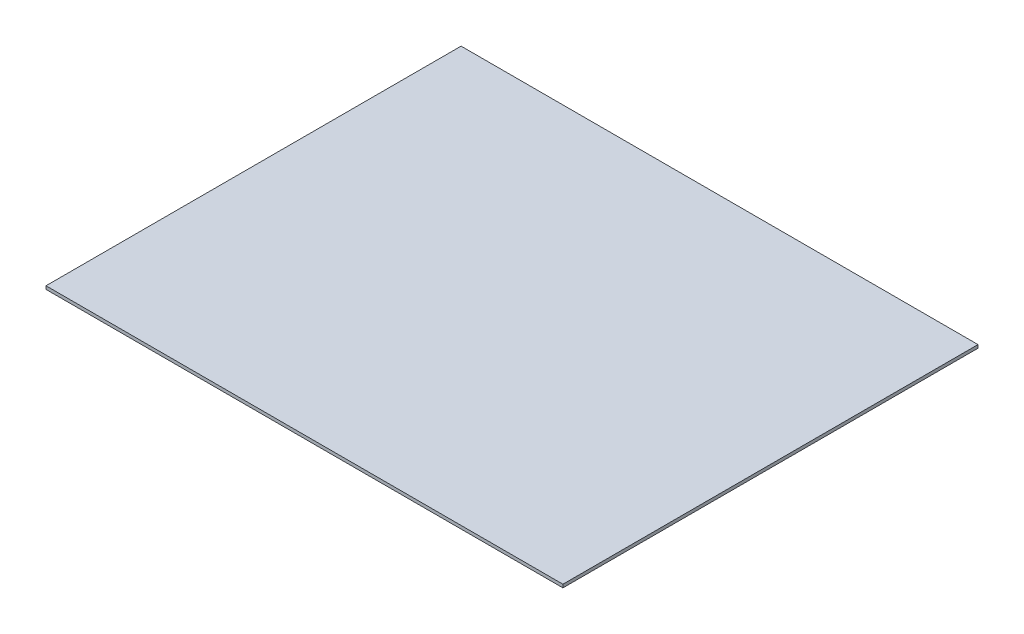
ISO-10303-21;
HEADER;
FILE_DESCRIPTION(('STEP AP214'),'2;1');
FILE_NAME('part.step','',(''),(''),'','','');
FILE_SCHEMA(('AUTOMOTIVE_DESIGN { 1 0 10303 214 1 1 1 1 }'));
ENDSEC;
DATA;
#1=APPLICATION_CONTEXT('core data for automotive mechanical design processes');
#2=APPLICATION_PROTOCOL_DEFINITION('international standard','automotive_design',2000,#1);
#3=PRODUCT_CONTEXT('',#1,'mechanical');
#4=PRODUCT('Part','Part','',(#3));
#5=PRODUCT_RELATED_PRODUCT_CATEGORY('part','',(#4));
#6=PRODUCT_DEFINITION_FORMATION('','',#4);
#7=PRODUCT_DEFINITION_CONTEXT('part definition',#1,'design');
#8=PRODUCT_DEFINITION('design','',#6,#7);
#9=PRODUCT_DEFINITION_SHAPE('','',#8);
#10=(LENGTH_UNIT() NAMED_UNIT(*) SI_UNIT(.MILLI.,.METRE.));
#11=(NAMED_UNIT(*) PLANE_ANGLE_UNIT() SI_UNIT($,.RADIAN.));
#12=(NAMED_UNIT(*) SI_UNIT($,.STERADIAN.) SOLID_ANGLE_UNIT());
#13=UNCERTAINTY_MEASURE_WITH_UNIT(LENGTH_MEASURE(1.E-05),#10,'distance_accuracy_value','');
#14=(GEOMETRIC_REPRESENTATION_CONTEXT(3) GLOBAL_UNCERTAINTY_ASSIGNED_CONTEXT((#13)) GLOBAL_UNIT_ASSIGNED_CONTEXT((#10,
#11,#12)) REPRESENTATION_CONTEXT('',''));
#15=CARTESIAN_POINT('',(0.,0.,0.));
#16=DIRECTION('',(0.,0.,1.));
#17=DIRECTION('',(1.,0.,0.));
#18=AXIS2_PLACEMENT_3D('',#15,#16,#17);
#19=CARTESIAN_POINT('',(0.,0.,0.));
#20=DIRECTION('',(0.,1.,0.));
#21=DIRECTION('',(1.,0.,0.));
#22=AXIS2_PLACEMENT_3D('',#19,#20,#21);
#23=PLANE('',#22);
#24=DIRECTION('',(0.,0.,-1.));
#25=VECTOR('',#24,1.);
#26=CARTESIAN_POINT('',(406.,0.,326.));
#27=LINE('',#26,#25);
#28=CARTESIAN_POINT('',(406.,0.,326.));
#29=VERTEX_POINT('',#28);
#30=CARTESIAN_POINT('',(406.,0.,-326.));
#31=VERTEX_POINT('',#30);
#32=EDGE_CURVE('E25',#29,#31,#27,.T.);
#33=ORIENTED_EDGE('',*,*,#32,.F.);
#34=DIRECTION('',(1.,0.,0.));
#35=VECTOR('',#34,1.);
#36=CARTESIAN_POINT('',(-406.,0.,326.));
#37=LINE('',#36,#35);
#38=CARTESIAN_POINT('',(-406.,0.,326.));
#39=VERTEX_POINT('',#38);
#40=EDGE_CURVE('E86',#39,#29,#37,.T.);
#41=ORIENTED_EDGE('',*,*,#40,.F.);
#42=DIRECTION('',(0.,0.,1.));
#43=VECTOR('',#42,1.);
#44=CARTESIAN_POINT('',(-406.,0.,-326.));
#45=LINE('',#44,#43);
#46=CARTESIAN_POINT('',(-406.,0.,-326.));
#47=VERTEX_POINT('',#46);
#48=EDGE_CURVE('E69',#47,#39,#45,.T.);
#49=ORIENTED_EDGE('',*,*,#48,.F.);
#50=DIRECTION('',(-1.,0.,0.));
#51=VECTOR('',#50,1.);
#52=CARTESIAN_POINT('',(406.,0.,-326.));
#53=LINE('',#52,#51);
#54=EDGE_CURVE('E108',#31,#47,#53,.T.);
#55=ORIENTED_EDGE('',*,*,#54,.F.);
#56=EDGE_LOOP('',(#33,#41,#49,#55));
#57=FACE_BOUND('',#56,.T.);
#58=ADVANCED_FACE('F17',(#57),#23,.F.);
#59=CARTESIAN_POINT('',(0.,5.,0.));
#60=DIRECTION('',(0.,1.,0.));
#61=DIRECTION('',(1.,0.,0.));
#62=AXIS2_PLACEMENT_3D('',#59,#60,#61);
#63=PLANE('',#62);
#64=DIRECTION('',(0.,0.,-1.));
#65=VECTOR('',#64,1.);
#66=CARTESIAN_POINT('',(406.,5.,326.));
#67=LINE('',#66,#65);
#68=CARTESIAN_POINT('',(406.,5.,326.));
#69=VERTEX_POINT('',#68);
#70=CARTESIAN_POINT('',(406.,5.,-326.));
#71=VERTEX_POINT('',#70);
#72=EDGE_CURVE('E11',#69,#71,#67,.T.);
#73=ORIENTED_EDGE('',*,*,#72,.T.);
#74=DIRECTION('',(-1.,0.,0.));
#75=VECTOR('',#74,1.);
#76=CARTESIAN_POINT('',(406.,5.,-326.));
#77=LINE('',#76,#75);
#78=CARTESIAN_POINT('',(-406.,5.,-326.));
#79=VERTEX_POINT('',#78);
#80=EDGE_CURVE('E102',#71,#79,#77,.T.);
#81=ORIENTED_EDGE('',*,*,#80,.T.);
#82=DIRECTION('',(0.,0.,1.));
#83=VECTOR('',#82,1.);
#84=CARTESIAN_POINT('',(-406.,5.,-326.));
#85=LINE('',#84,#83);
#86=CARTESIAN_POINT('',(-406.,5.,326.));
#87=VERTEX_POINT('',#86);
#88=EDGE_CURVE('E85',#79,#87,#85,.T.);
#89=ORIENTED_EDGE('',*,*,#88,.T.);
#90=DIRECTION('',(1.,0.,0.));
#91=VECTOR('',#90,1.);
#92=CARTESIAN_POINT('',(-406.,5.,326.));
#93=LINE('',#92,#91);
#94=EDGE_CURVE('E90',#87,#69,#93,.T.);
#95=ORIENTED_EDGE('',*,*,#94,.T.);
#96=EDGE_LOOP('',(#73,#81,#89,#95));
#97=FACE_BOUND('',#96,.T.);
#98=ADVANCED_FACE('F158',(#97),#63,.T.);
#99=CARTESIAN_POINT('',(406.,0.,326.));
#100=DIRECTION('',(1.,0.,0.));
#101=DIRECTION('',(0.,1.,0.));
#102=AXIS2_PLACEMENT_3D('',#99,#100,#101);
#103=PLANE('',#102);
#104=ORIENTED_EDGE('',*,*,#32,.T.);
#105=DIRECTION('',(0.,1.,0.));
#106=VECTOR('',#105,1.);
#107=CARTESIAN_POINT('',(406.,0.,-326.));
#108=LINE('',#107,#106);
#109=EDGE_CURVE('E101',#31,#71,#108,.T.);
#110=ORIENTED_EDGE('',*,*,#109,.T.);
#111=ORIENTED_EDGE('',*,*,#72,.F.);
#112=DIRECTION('',(0.,1.,0.));
#113=VECTOR('',#112,1.);
#114=CARTESIAN_POINT('',(406.,0.,326.));
#115=LINE('',#114,#113);
#116=EDGE_CURVE('E91',#29,#69,#115,.T.);
#117=ORIENTED_EDGE('',*,*,#116,.F.);
#118=EDGE_LOOP('',(#104,#110,#111,#117));
#119=FACE_BOUND('',#118,.T.);
#120=ADVANCED_FACE('F164',(#119),#103,.T.);
#121=CARTESIAN_POINT('',(406.,0.,-326.));
#122=DIRECTION('',(0.,0.,-1.));
#123=DIRECTION('',(0.,-1.,0.));
#124=AXIS2_PLACEMENT_3D('',#121,#122,#123);
#125=PLANE('',#124);
#126=ORIENTED_EDGE('',*,*,#54,.T.);
#127=DIRECTION('',(0.,1.,0.));
#128=VECTOR('',#127,1.);
#129=CARTESIAN_POINT('',(-406.,0.,-326.));
#130=LINE('',#129,#128);
#131=EDGE_CURVE('E80',#47,#79,#130,.T.);
#132=ORIENTED_EDGE('',*,*,#131,.T.);
#133=ORIENTED_EDGE('',*,*,#80,.F.);
#134=ORIENTED_EDGE('',*,*,#109,.F.);
#135=EDGE_LOOP('',(#126,#132,#133,#134));
#136=FACE_BOUND('',#135,.T.);
#137=ADVANCED_FACE('F172',(#136),#125,.T.);
#138=CARTESIAN_POINT('',(-406.,0.,-326.));
#139=DIRECTION('',(-1.,0.,0.));
#140=DIRECTION('',(0.,0.,1.));
#141=AXIS2_PLACEMENT_3D('',#138,#139,#140);
#142=PLANE('',#141);
#143=ORIENTED_EDGE('',*,*,#48,.T.);
#144=DIRECTION('',(0.,1.,0.));
#145=VECTOR('',#144,1.);
#146=CARTESIAN_POINT('',(-406.,0.,326.));
#147=LINE('',#146,#145);
#148=EDGE_CURVE('E72',#39,#87,#147,.T.);
#149=ORIENTED_EDGE('',*,*,#148,.T.);
#150=ORIENTED_EDGE('',*,*,#88,.F.);
#151=ORIENTED_EDGE('',*,*,#131,.F.);
#152=EDGE_LOOP('',(#143,#149,#150,#151));
#153=FACE_BOUND('',#152,.T.);
#154=ADVANCED_FACE('F71',(#153),#142,.T.);
#155=CARTESIAN_POINT('',(-406.,0.,326.));
#156=DIRECTION('',(0.,0.,1.));
#157=DIRECTION('',(1.,0.,0.));
#158=AXIS2_PLACEMENT_3D('',#155,#156,#157);
#159=PLANE('',#158);
#160=ORIENTED_EDGE('',*,*,#40,.T.);
#161=ORIENTED_EDGE('',*,*,#116,.T.);
#162=ORIENTED_EDGE('',*,*,#94,.F.);
#163=ORIENTED_EDGE('',*,*,#148,.F.);
#164=EDGE_LOOP('',(#160,#161,#162,#163));
#165=FACE_BOUND('',#164,.T.);
#166=ADVANCED_FACE('F88',(#165),#159,.T.);
#167=CLOSED_SHELL('',(#58,#98,#120,#137,#154,#166));
#168=MANIFOLD_SOLID_BREP('B1',#167);
#169=ADVANCED_BREP_SHAPE_REPRESENTATION('',(#18,#168),#14);
#170=SHAPE_DEFINITION_REPRESENTATION(#9,#169);
ENDSEC;
END-ISO-10303-21;
